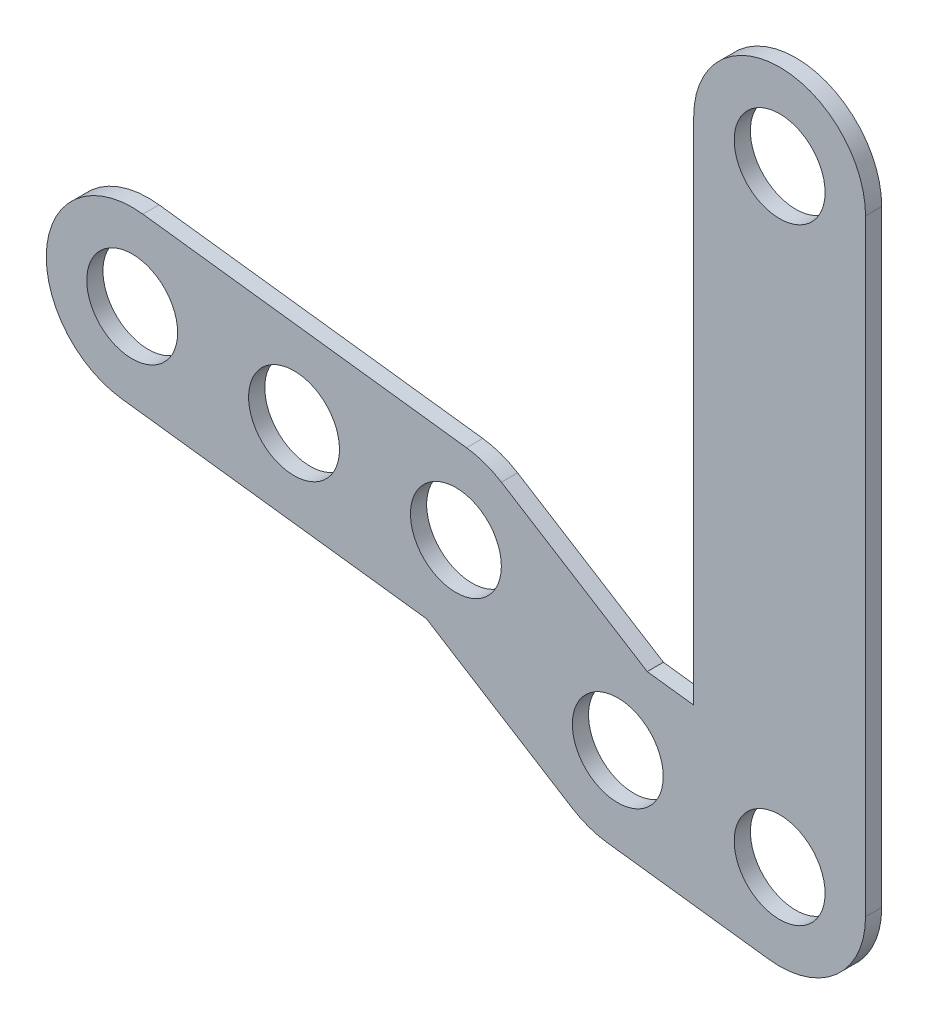
ISO-10303-21;
HEADER;
FILE_DESCRIPTION(('STEP AP214'),'2;1');
FILE_NAME('part.step','',(''),(''),'','','');
FILE_SCHEMA(('AUTOMOTIVE_DESIGN { 1 0 10303 214 1 1 1 1 }'));
ENDSEC;
DATA;
#1=APPLICATION_CONTEXT('core data for automotive mechanical design processes');
#2=APPLICATION_PROTOCOL_DEFINITION('international standard','automotive_design',2000,#1);
#3=PRODUCT_CONTEXT('',#1,'mechanical');
#4=PRODUCT('Part','Part','',(#3));
#5=PRODUCT_RELATED_PRODUCT_CATEGORY('part','',(#4));
#6=PRODUCT_DEFINITION_FORMATION('','',#4);
#7=PRODUCT_DEFINITION_CONTEXT('part definition',#1,'design');
#8=PRODUCT_DEFINITION('design','',#6,#7);
#9=PRODUCT_DEFINITION_SHAPE('','',#8);
#10=(LENGTH_UNIT() NAMED_UNIT(*) SI_UNIT(.MILLI.,.METRE.));
#11=(NAMED_UNIT(*) PLANE_ANGLE_UNIT() SI_UNIT($,.RADIAN.));
#12=(NAMED_UNIT(*) SI_UNIT($,.STERADIAN.) SOLID_ANGLE_UNIT());
#13=UNCERTAINTY_MEASURE_WITH_UNIT(LENGTH_MEASURE(1.E-05),#10,'distance_accuracy_value','');
#14=(GEOMETRIC_REPRESENTATION_CONTEXT(3) GLOBAL_UNCERTAINTY_ASSIGNED_CONTEXT((#13)) GLOBAL_UNIT_ASSIGNED_CONTEXT((#10,
#11,#12)) REPRESENTATION_CONTEXT('',''));
#15=CARTESIAN_POINT('',(0.,0.,0.));
#16=DIRECTION('',(0.,0.,1.));
#17=DIRECTION('',(1.,0.,0.));
#18=AXIS2_PLACEMENT_3D('',#15,#16,#17);
#19=CARTESIAN_POINT('',(266.699999999886,31.749999999901,5.08));
#20=DIRECTION('',(0.,0.,1.));
#21=DIRECTION('',(1.,0.,0.));
#22=AXIS2_PLACEMENT_3D('',#19,#20,#21);
#23=PLANE('',#22);
#24=CARTESIAN_POINT('',(266.699999999692,222.24999999973,5.08));
#25=DIRECTION('',(0.,0.,1.));
#26=DIRECTION('',(1.,0.,0.));
#27=AXIS2_PLACEMENT_3D('',#24,#25,#26);
#28=CIRCLE('',#27,14.2621000003079);
#29=CARTESIAN_POINT('',(280.9621,222.24999999973,5.08));
#30=VERTEX_POINT('',#29);
#31=EDGE_CURVE('E322',#30,#30,#28,.T.);
#32=ORIENTED_EDGE('',*,*,#31,.F.);
#33=EDGE_LOOP('',(#32));
#34=FACE_BOUND('',#33,.T.);
#35=CARTESIAN_POINT('',(165.09999999997,69.8499999997621,5.08));
#36=DIRECTION('',(0.,0.,1.));
#37=DIRECTION('',(1.,0.,0.));
#38=AXIS2_PLACEMENT_3D('',#35,#36,#37);
#39=CIRCLE('',#38,14.2621000000297);
#40=CARTESIAN_POINT('',(179.3621,69.8499999997621,5.08));
#41=VERTEX_POINT('',#40);
#42=EDGE_CURVE('E334',#41,#41,#39,.T.);
#43=ORIENTED_EDGE('',*,*,#42,.F.);
#44=EDGE_LOOP('',(#43));
#45=FACE_BOUND('',#44,.T.);
#46=CARTESIAN_POINT('',(63.5,82.55,5.08));
#47=DIRECTION('',(0.,0.,1.));
#48=DIRECTION('',(1.,0.,0.));
#49=AXIS2_PLACEMENT_3D('',#46,#47,#48);
#50=CIRCLE('',#49,14.2621);
#51=CARTESIAN_POINT('',(77.7621,82.55,5.08));
#52=VERTEX_POINT('',#51);
#53=EDGE_CURVE('E174',#52,#52,#50,.T.);
#54=ORIENTED_EDGE('',*,*,#53,.F.);
#55=EDGE_LOOP('',(#54));
#56=FACE_BOUND('',#55,.T.);
#57=CARTESIAN_POINT('',(266.699999999886,31.749999999901,5.08));
#58=DIRECTION('',(0.,0.,1.));
#59=DIRECTION('',(1.,0.,0.));
#60=AXIS2_PLACEMENT_3D('',#57,#58,#59);
#61=CIRCLE('',#60,26.9620999996552);
#62=CARTESIAN_POINT('',(263.355763081523,4.99610466061885,5.08));
#63=VERTEX_POINT('',#62);
#64=CARTESIAN_POINT('',(293.662099999541,31.749999999901,5.08));
#65=VERTEX_POINT('',#64);
#66=EDGE_CURVE('E195',#63,#65,#61,.T.);
#67=ORIENTED_EDGE('',*,*,#66,.T.);
#68=DIRECTION('',(0.,1.,0.));
#69=VECTOR('',#68,1.);
#70=CARTESIAN_POINT('',(293.662099999541,222.249999999901,5.08));
#71=LINE('',#70,#69);
#72=CARTESIAN_POINT('',(293.662099999541,222.249999999901,5.08));
#73=VERTEX_POINT('',#72);
#74=EDGE_CURVE('E118',#65,#73,#71,.T.);
#75=ORIENTED_EDGE('',*,*,#74,.T.);
#76=CARTESIAN_POINT('',(266.699999999692,222.24999999973,5.08));
#77=DIRECTION('',(0.,0.,1.));
#78=DIRECTION('',(1.,0.,0.));
#79=AXIS2_PLACEMENT_3D('',#76,#77,#78);
#80=CIRCLE('',#79,26.962099999849);
#81=CARTESIAN_POINT('',(239.737899999843,222.249999999559,5.08));
#82=VERTEX_POINT('',#81);
#83=EDGE_CURVE('E225',#73,#82,#80,.T.);
#84=ORIENTED_EDGE('',*,*,#83,.T.);
#85=DIRECTION('',(0.,-1.,0.));
#86=VECTOR('',#85,1.);
#87=CARTESIAN_POINT('',(239.737899999843,222.249999999559,5.08));
#88=LINE('',#87,#86);
#89=CARTESIAN_POINT('',(239.737899999843,62.2921874545589,5.08));
#90=VERTEX_POINT('',#89);
#91=EDGE_CURVE('E244',#82,#90,#88,.T.);
#92=ORIENTED_EDGE('',*,*,#91,.T.);
#93=DIRECTION('',(-0.992277876708353,0.124034734631725,0.));
#94=VECTOR('',#93,1.);
#95=CARTESIAN_POINT('',(225.146135762043,64.1161579849188,5.08));
#96=LINE('',#95,#94);
#97=CARTESIAN_POINT('',(225.146135762043,64.1161579849188,5.08));
#98=VERTEX_POINT('',#97);
#99=EDGE_CURVE('E241',#90,#98,#96,.T.);
#100=ORIENTED_EDGE('',*,*,#99,.T.);
#101=DIRECTION('',(-0.847998304020956,0.529998939977792,0.));
#102=VECTOR('',#101,1.);
#103=CARTESIAN_POINT('',(179.389884419763,92.7138150719389,5.08));
#104=LINE('',#103,#102);
#105=CARTESIAN_POINT('',(179.389884419763,92.7138150719389,5.08));
#106=VERTEX_POINT('',#105);
#107=EDGE_CURVE('E243',#98,#106,#104,.T.);
#108=ORIENTED_EDGE('',*,*,#107,.T.);
#109=CARTESIAN_POINT('',(165.09999999997,69.8499999997621,5.08));
#110=DIRECTION('',(0.,0.,1.));
#111=DIRECTION('',(1.,0.,0.));
#112=AXIS2_PLACEMENT_3D('',#109,#110,#111);
#113=CIRCLE('',#112,26.96209999955);
#114=CARTESIAN_POINT('',(168.44423691832,96.60389533894,5.08));
#115=VERTEX_POINT('',#114);
#116=EDGE_CURVE('E246',#106,#115,#113,.T.);
#117=ORIENTED_EDGE('',*,*,#116,.T.);
#118=DIRECTION('',(-0.992277876713668,0.124034734589209,0.));
#119=VECTOR('',#118,1.);
#120=CARTESIAN_POINT('',(66.84423691832,109.30389533894,5.08));
#121=LINE('',#120,#119);
#122=CARTESIAN_POINT('',(66.84423691832,109.30389533894,5.08));
#123=VERTEX_POINT('',#122);
#124=EDGE_CURVE('E252',#115,#123,#121,.T.);
#125=ORIENTED_EDGE('',*,*,#124,.T.);
#126=CARTESIAN_POINT('',(63.5,82.55,5.08));
#127=DIRECTION('',(0.,0.,1.));
#128=DIRECTION('',(1.,0.,0.));
#129=AXIS2_PLACEMENT_3D('',#126,#127,#128);
#130=CIRCLE('',#129,26.9620999993103);
#131=CARTESIAN_POINT('',(60.15576308168,55.79610466106,5.08));
#132=VERTEX_POINT('',#131);
#133=EDGE_CURVE('E254',#123,#132,#130,.T.);
#134=ORIENTED_EDGE('',*,*,#133,.T.);
#135=DIRECTION('',(0.992277876711237,-0.124034734608657,0.));
#136=VECTOR('',#135,1.);
#137=CARTESIAN_POINT('',(60.15576308168,55.79610466106,5.08));
#138=LINE('',#137,#136);
#139=CARTESIAN_POINT('',(155.8538642378,43.83384201464,5.08));
#140=VERTEX_POINT('',#139);
#141=EDGE_CURVE('E152',#132,#140,#138,.T.);
#142=ORIENTED_EDGE('',*,*,#141,.T.);
#143=DIRECTION('',(0.847998304020955,-0.529998939977792,0.));
#144=VECTOR('',#143,1.);
#145=CARTESIAN_POINT('',(155.8538642378,43.83384201464,5.08));
#146=LINE('',#145,#144);
#147=CARTESIAN_POINT('',(201.61011558008,15.23618492762,5.08));
#148=VERTEX_POINT('',#147);
#149=EDGE_CURVE('E146',#140,#148,#146,.T.);
#150=ORIENTED_EDGE('',*,*,#149,.T.);
#151=CARTESIAN_POINT('',(215.899999999873,38.0999999997967,5.08));
#152=DIRECTION('',(0.,0.,1.));
#153=DIRECTION('',(1.,0.,0.));
#154=AXIS2_PLACEMENT_3D('',#151,#152,#153);
#155=CIRCLE('',#154,26.96209999955);
#156=CARTESIAN_POINT('',(212.555763081523,11.3461046606189,5.08));
#157=VERTEX_POINT('',#156);
#158=EDGE_CURVE('E150',#148,#157,#155,.T.);
#159=ORIENTED_EDGE('',*,*,#158,.T.);
#160=DIRECTION('',(0.992277876713668,-0.124034734589208,0.));
#161=VECTOR('',#160,1.);
#162=CARTESIAN_POINT('',(212.555763081523,11.3461046606189,5.08));
#163=LINE('',#162,#161);
#164=EDGE_CURVE('E60',#157,#63,#163,.T.);
#165=ORIENTED_EDGE('',*,*,#164,.T.);
#166=EDGE_LOOP('',(#67,#75,#84,#92,#100,#108,#117,#125,#134,#142,#150,#159,#165));
#167=FACE_BOUND('',#166,.T.);
#168=CARTESIAN_POINT('',(114.3,76.2,5.08));
#169=DIRECTION('',(0.,0.,1.));
#170=DIRECTION('',(1.,0.,0.));
#171=AXIS2_PLACEMENT_3D('',#168,#169,#170);
#172=CIRCLE('',#171,14.2621);
#173=CARTESIAN_POINT('',(128.5621,76.2,5.08));
#174=VERTEX_POINT('',#173);
#175=EDGE_CURVE('E340',#174,#174,#172,.T.);
#176=ORIENTED_EDGE('',*,*,#175,.F.);
#177=EDGE_LOOP('',(#176));
#178=FACE_BOUND('',#177,.T.);
#179=CARTESIAN_POINT('',(215.899999999873,38.0999999997967,5.08));
#180=DIRECTION('',(0.,0.,1.));
#181=DIRECTION('',(1.,0.,0.));
#182=AXIS2_PLACEMENT_3D('',#179,#180,#181);
#183=CIRCLE('',#182,14.262100000127);
#184=CARTESIAN_POINT('',(230.1621,38.0999999997967,5.08));
#185=VERTEX_POINT('',#184);
#186=EDGE_CURVE('E328',#185,#185,#183,.T.);
#187=ORIENTED_EDGE('',*,*,#186,.F.);
#188=EDGE_LOOP('',(#187));
#189=FACE_BOUND('',#188,.T.);
#190=CARTESIAN_POINT('',(266.699999999886,31.749999999901,5.08));
#191=DIRECTION('',(0.,0.,1.));
#192=DIRECTION('',(1.,0.,0.));
#193=AXIS2_PLACEMENT_3D('',#190,#191,#192);
#194=CIRCLE('',#193,14.2621000001141);
#195=CARTESIAN_POINT('',(280.9621,31.749999999901,5.08));
#196=VERTEX_POINT('',#195);
#197=EDGE_CURVE('E313',#196,#196,#194,.T.);
#198=ORIENTED_EDGE('',*,*,#197,.F.);
#199=EDGE_LOOP('',(#198));
#200=FACE_BOUND('',#199,.T.);
#201=ADVANCED_FACE('F43',(#34,#45,#56,#167,#178,#189,#200),#23,.T.);
#202=CARTESIAN_POINT('',(266.699999999886,31.749999999901,0.));
#203=DIRECTION('',(0.,0.,1.));
#204=DIRECTION('',(1.,0.,0.));
#205=AXIS2_PLACEMENT_3D('',#202,#203,#204);
#206=PLANE('',#205);
#207=CARTESIAN_POINT('',(266.699999999886,31.749999999901,0.));
#208=DIRECTION('',(0.,0.,1.));
#209=DIRECTION('',(1.,0.,0.));
#210=AXIS2_PLACEMENT_3D('',#207,#208,#209);
#211=CIRCLE('',#210,26.9620999996552);
#212=CARTESIAN_POINT('',(263.355763081523,4.99610466061885,0.));
#213=VERTEX_POINT('',#212);
#214=CARTESIAN_POINT('',(293.662099999541,31.749999999901,0.));
#215=VERTEX_POINT('',#214);
#216=EDGE_CURVE('E170',#213,#215,#211,.T.);
#217=ORIENTED_EDGE('',*,*,#216,.F.);
#218=DIRECTION('',(0.992277876713668,-0.124034734589208,0.));
#219=VECTOR('',#218,1.);
#220=CARTESIAN_POINT('',(212.555763081523,11.3461046606189,0.));
#221=LINE('',#220,#219);
#222=CARTESIAN_POINT('',(212.555763081523,11.3461046606189,0.));
#223=VERTEX_POINT('',#222);
#224=EDGE_CURVE('E110',#223,#213,#221,.T.);
#225=ORIENTED_EDGE('',*,*,#224,.F.);
#226=CARTESIAN_POINT('',(215.899999999873,38.0999999997967,0.));
#227=DIRECTION('',(0.,0.,1.));
#228=DIRECTION('',(1.,0.,0.));
#229=AXIS2_PLACEMENT_3D('',#226,#227,#228);
#230=CIRCLE('',#229,26.96209999955);
#231=CARTESIAN_POINT('',(201.61011558008,15.23618492762,0.));
#232=VERTEX_POINT('',#231);
#233=EDGE_CURVE('E104',#232,#223,#230,.T.);
#234=ORIENTED_EDGE('',*,*,#233,.F.);
#235=DIRECTION('',(0.847998304020955,-0.529998939977792,0.));
#236=VECTOR('',#235,1.);
#237=CARTESIAN_POINT('',(155.8538642378,43.83384201464,0.));
#238=LINE('',#237,#236);
#239=CARTESIAN_POINT('',(155.8538642378,43.83384201464,0.));
#240=VERTEX_POINT('',#239);
#241=EDGE_CURVE('E160',#240,#232,#238,.T.);
#242=ORIENTED_EDGE('',*,*,#241,.F.);
#243=DIRECTION('',(0.992277876711237,-0.124034734608657,0.));
#244=VECTOR('',#243,1.);
#245=CARTESIAN_POINT('',(60.15576308168,55.79610466106,0.));
#246=LINE('',#245,#244);
#247=CARTESIAN_POINT('',(60.15576308168,55.79610466106,0.));
#248=VERTEX_POINT('',#247);
#249=EDGE_CURVE('E190',#248,#240,#246,.T.);
#250=ORIENTED_EDGE('',*,*,#249,.F.);
#251=CARTESIAN_POINT('',(63.5,82.55,0.));
#252=DIRECTION('',(0.,0.,1.));
#253=DIRECTION('',(1.,0.,0.));
#254=AXIS2_PLACEMENT_3D('',#251,#252,#253);
#255=CIRCLE('',#254,26.9620999993103);
#256=CARTESIAN_POINT('',(66.84423691832,109.30389533894,0.));
#257=VERTEX_POINT('',#256);
#258=EDGE_CURVE('E188',#257,#248,#255,.T.);
#259=ORIENTED_EDGE('',*,*,#258,.F.);
#260=DIRECTION('',(-0.992277876713668,0.124034734589209,0.));
#261=VECTOR('',#260,1.);
#262=CARTESIAN_POINT('',(66.84423691832,109.30389533894,0.));
#263=LINE('',#262,#261);
#264=CARTESIAN_POINT('',(168.44423691832,96.60389533894,0.));
#265=VERTEX_POINT('',#264);
#266=EDGE_CURVE('E186',#265,#257,#263,.T.);
#267=ORIENTED_EDGE('',*,*,#266,.F.);
#268=CARTESIAN_POINT('',(165.09999999997,69.8499999997621,0.));
#269=DIRECTION('',(0.,0.,1.));
#270=DIRECTION('',(1.,0.,0.));
#271=AXIS2_PLACEMENT_3D('',#268,#269,#270);
#272=CIRCLE('',#271,26.96209999955);
#273=CARTESIAN_POINT('',(179.389884419763,92.7138150719389,0.));
#274=VERTEX_POINT('',#273);
#275=EDGE_CURVE('E184',#274,#265,#272,.T.);
#276=ORIENTED_EDGE('',*,*,#275,.F.);
#277=DIRECTION('',(-0.847998304020956,0.529998939977792,0.));
#278=VECTOR('',#277,1.);
#279=CARTESIAN_POINT('',(179.389884419763,92.7138150719389,0.));
#280=LINE('',#279,#278);
#281=CARTESIAN_POINT('',(225.146135762043,64.1161579849188,0.));
#282=VERTEX_POINT('',#281);
#283=EDGE_CURVE('E182',#282,#274,#280,.T.);
#284=ORIENTED_EDGE('',*,*,#283,.F.);
#285=DIRECTION('',(-0.992277876708353,0.124034734631725,0.));
#286=VECTOR('',#285,1.);
#287=CARTESIAN_POINT('',(225.146135762043,64.1161579849188,0.));
#288=LINE('',#287,#286);
#289=CARTESIAN_POINT('',(239.737899999843,62.2921874545589,0.));
#290=VERTEX_POINT('',#289);
#291=EDGE_CURVE('E180',#290,#282,#288,.T.);
#292=ORIENTED_EDGE('',*,*,#291,.F.);
#293=DIRECTION('',(0.,-1.,0.));
#294=VECTOR('',#293,1.);
#295=CARTESIAN_POINT('',(239.737899999843,222.249999999559,0.));
#296=LINE('',#295,#294);
#297=CARTESIAN_POINT('',(239.737899999843,222.249999999559,0.));
#298=VERTEX_POINT('',#297);
#299=EDGE_CURVE('E178',#298,#290,#296,.T.);
#300=ORIENTED_EDGE('',*,*,#299,.F.);
#301=CARTESIAN_POINT('',(266.699999999692,222.24999999973,0.));
#302=DIRECTION('',(0.,0.,1.));
#303=DIRECTION('',(1.,0.,0.));
#304=AXIS2_PLACEMENT_3D('',#301,#302,#303);
#305=CIRCLE('',#304,26.962099999849);
#306=CARTESIAN_POINT('',(293.662099999541,222.249999999901,0.));
#307=VERTEX_POINT('',#306);
#308=EDGE_CURVE('E176',#307,#298,#305,.T.);
#309=ORIENTED_EDGE('',*,*,#308,.F.);
#310=DIRECTION('',(0.,1.,0.));
#311=VECTOR('',#310,1.);
#312=CARTESIAN_POINT('',(293.662099999541,222.249999999901,0.));
#313=LINE('',#312,#311);
#314=EDGE_CURVE('E173',#215,#307,#313,.T.);
#315=ORIENTED_EDGE('',*,*,#314,.F.);
#316=EDGE_LOOP('',(#217,#225,#234,#242,#250,#259,#267,#276,#284,#292,#300,#309,#315));
#317=FACE_BOUND('',#316,.T.);
#318=CARTESIAN_POINT('',(63.5,82.55,0.));
#319=DIRECTION('',(0.,0.,1.));
#320=DIRECTION('',(1.,0.,0.));
#321=AXIS2_PLACEMENT_3D('',#318,#319,#320);
#322=CIRCLE('',#321,14.2621);
#323=CARTESIAN_POINT('',(77.7621,82.55,0.));
#324=VERTEX_POINT('',#323);
#325=EDGE_CURVE('E343',#324,#324,#322,.T.);
#326=ORIENTED_EDGE('',*,*,#325,.T.);
#327=EDGE_LOOP('',(#326));
#328=FACE_BOUND('',#327,.T.);
#329=CARTESIAN_POINT('',(114.3,76.2,0.));
#330=DIRECTION('',(0.,0.,1.));
#331=DIRECTION('',(1.,0.,0.));
#332=AXIS2_PLACEMENT_3D('',#329,#330,#331);
#333=CIRCLE('',#332,14.2621);
#334=CARTESIAN_POINT('',(128.5621,76.2,0.));
#335=VERTEX_POINT('',#334);
#336=EDGE_CURVE('E337',#335,#335,#333,.T.);
#337=ORIENTED_EDGE('',*,*,#336,.T.);
#338=EDGE_LOOP('',(#337));
#339=FACE_BOUND('',#338,.T.);
#340=CARTESIAN_POINT('',(165.09999999997,69.8499999997621,0.));
#341=DIRECTION('',(0.,0.,1.));
#342=DIRECTION('',(1.,0.,0.));
#343=AXIS2_PLACEMENT_3D('',#340,#341,#342);
#344=CIRCLE('',#343,14.2621000000297);
#345=CARTESIAN_POINT('',(179.3621,69.8499999997621,0.));
#346=VERTEX_POINT('',#345);
#347=EDGE_CURVE('E331',#346,#346,#344,.T.);
#348=ORIENTED_EDGE('',*,*,#347,.T.);
#349=EDGE_LOOP('',(#348));
#350=FACE_BOUND('',#349,.T.);
#351=CARTESIAN_POINT('',(215.899999999873,38.0999999997967,0.));
#352=DIRECTION('',(0.,0.,1.));
#353=DIRECTION('',(1.,0.,0.));
#354=AXIS2_PLACEMENT_3D('',#351,#352,#353);
#355=CIRCLE('',#354,14.262100000127);
#356=CARTESIAN_POINT('',(230.1621,38.0999999997967,0.));
#357=VERTEX_POINT('',#356);
#358=EDGE_CURVE('E325',#357,#357,#355,.T.);
#359=ORIENTED_EDGE('',*,*,#358,.T.);
#360=EDGE_LOOP('',(#359));
#361=FACE_BOUND('',#360,.T.);
#362=CARTESIAN_POINT('',(266.699999999692,222.24999999973,0.));
#363=DIRECTION('',(0.,0.,1.));
#364=DIRECTION('',(1.,0.,0.));
#365=AXIS2_PLACEMENT_3D('',#362,#363,#364);
#366=CIRCLE('',#365,14.2621000003079);
#367=CARTESIAN_POINT('',(280.9621,222.24999999973,0.));
#368=VERTEX_POINT('',#367);
#369=EDGE_CURVE('E319',#368,#368,#366,.T.);
#370=ORIENTED_EDGE('',*,*,#369,.T.);
#371=EDGE_LOOP('',(#370));
#372=FACE_BOUND('',#371,.T.);
#373=CARTESIAN_POINT('',(266.699999999886,31.749999999901,0.));
#374=DIRECTION('',(0.,0.,1.));
#375=DIRECTION('',(1.,0.,0.));
#376=AXIS2_PLACEMENT_3D('',#373,#374,#375);
#377=CIRCLE('',#376,14.2621000001141);
#378=CARTESIAN_POINT('',(280.9621,31.749999999901,0.));
#379=VERTEX_POINT('',#378);
#380=EDGE_CURVE('E316',#379,#379,#377,.T.);
#381=ORIENTED_EDGE('',*,*,#380,.T.);
#382=EDGE_LOOP('',(#381));
#383=FACE_BOUND('',#382,.T.);
#384=ADVANCED_FACE('F229',(#317,#328,#339,#350,#361,#372,#383),#206,.F.);
#385=CARTESIAN_POINT('',(266.699999999886,31.749999999901,5.08));
#386=DIRECTION('',(0.,0.,-1.));
#387=DIRECTION('',(-1.,0.,0.));
#388=AXIS2_PLACEMENT_3D('',#385,#386,#387);
#389=CYLINDRICAL_SURFACE('',#388,26.9620999996552);
#390=ORIENTED_EDGE('',*,*,#216,.T.);
#391=DIRECTION('',(0.,0.,-1.));
#392=VECTOR('',#391,1.);
#393=CARTESIAN_POINT('',(293.662099999541,31.749999999901,5.08));
#394=LINE('',#393,#392);
#395=EDGE_CURVE('E11',#65,#215,#394,.T.);
#396=ORIENTED_EDGE('',*,*,#395,.F.);
#397=ORIENTED_EDGE('',*,*,#66,.F.);
#398=DIRECTION('',(0.,0.,-1.));
#399=VECTOR('',#398,1.);
#400=CARTESIAN_POINT('',(263.355763081523,4.99610466061885,5.08));
#401=LINE('',#400,#399);
#402=EDGE_CURVE('E166',#63,#213,#401,.T.);
#403=ORIENTED_EDGE('',*,*,#402,.T.);
#404=EDGE_LOOP('',(#390,#396,#397,#403));
#405=FACE_BOUND('',#404,.T.);
#406=ADVANCED_FACE('F45',(#405),#389,.T.);
#407=CARTESIAN_POINT('',(293.662099999541,222.249999999901,5.08));
#408=DIRECTION('',(-1.,0.,0.));
#409=DIRECTION('',(0.,0.,1.));
#410=AXIS2_PLACEMENT_3D('',#407,#408,#409);
#411=PLANE('',#410);
#412=ORIENTED_EDGE('',*,*,#314,.T.);
#413=DIRECTION('',(0.,0.,-1.));
#414=VECTOR('',#413,1.);
#415=CARTESIAN_POINT('',(293.662099999541,222.249999999901,5.08));
#416=LINE('',#415,#414);
#417=EDGE_CURVE('E52',#73,#307,#416,.T.);
#418=ORIENTED_EDGE('',*,*,#417,.F.);
#419=ORIENTED_EDGE('',*,*,#74,.F.);
#420=ORIENTED_EDGE('',*,*,#395,.T.);
#421=EDGE_LOOP('',(#412,#418,#419,#420));
#422=FACE_BOUND('',#421,.T.);
#423=ADVANCED_FACE('F487',(#422),#411,.F.);
#424=CARTESIAN_POINT('',(266.699999999692,222.24999999973,5.08));
#425=DIRECTION('',(0.,0.,-1.));
#426=DIRECTION('',(-1.,0.,0.));
#427=AXIS2_PLACEMENT_3D('',#424,#425,#426);
#428=CYLINDRICAL_SURFACE('',#427,26.962099999849);
#429=ORIENTED_EDGE('',*,*,#308,.T.);
#430=DIRECTION('',(0.,0.,-1.));
#431=VECTOR('',#430,1.);
#432=CARTESIAN_POINT('',(239.737899999843,222.249999999559,5.08));
#433=LINE('',#432,#431);
#434=EDGE_CURVE('E217',#82,#298,#433,.T.);
#435=ORIENTED_EDGE('',*,*,#434,.F.);
#436=ORIENTED_EDGE('',*,*,#83,.F.);
#437=ORIENTED_EDGE('',*,*,#417,.T.);
#438=EDGE_LOOP('',(#429,#435,#436,#437));
#439=FACE_BOUND('',#438,.T.);
#440=ADVANCED_FACE('F223',(#439),#428,.T.);
#441=CARTESIAN_POINT('',(239.737899999843,222.249999999559,5.08));
#442=DIRECTION('',(1.,0.,0.));
#443=DIRECTION('',(0.,0.,-1.));
#444=AXIS2_PLACEMENT_3D('',#441,#442,#443);
#445=PLANE('',#444);
#446=ORIENTED_EDGE('',*,*,#299,.T.);
#447=DIRECTION('',(0.,0.,-1.));
#448=VECTOR('',#447,1.);
#449=CARTESIAN_POINT('',(239.737899999843,62.2921874545589,5.08));
#450=LINE('',#449,#448);
#451=EDGE_CURVE('E214',#90,#290,#450,.T.);
#452=ORIENTED_EDGE('',*,*,#451,.F.);
#453=ORIENTED_EDGE('',*,*,#91,.F.);
#454=ORIENTED_EDGE('',*,*,#434,.T.);
#455=EDGE_LOOP('',(#446,#452,#453,#454));
#456=FACE_BOUND('',#455,.T.);
#457=ADVANCED_FACE('F235',(#456),#445,.F.);
#458=CARTESIAN_POINT('',(225.146135762043,64.1161579849188,5.08));
#459=DIRECTION('',(-0.124034734631725,-0.992277876708353,0.));
#460=DIRECTION('',(0.992277876708353,-0.124034734631725,0.));
#461=AXIS2_PLACEMENT_3D('',#458,#459,#460);
#462=PLANE('',#461);
#463=ORIENTED_EDGE('',*,*,#291,.T.);
#464=DIRECTION('',(0.,0.,-1.));
#465=VECTOR('',#464,1.);
#466=CARTESIAN_POINT('',(225.146135762043,64.1161579849188,5.08));
#467=LINE('',#466,#465);
#468=EDGE_CURVE('E211',#98,#282,#467,.T.);
#469=ORIENTED_EDGE('',*,*,#468,.F.);
#470=ORIENTED_EDGE('',*,*,#99,.F.);
#471=ORIENTED_EDGE('',*,*,#451,.T.);
#472=EDGE_LOOP('',(#463,#469,#470,#471));
#473=FACE_BOUND('',#472,.T.);
#474=ADVANCED_FACE('F239',(#473),#462,.F.);
#475=CARTESIAN_POINT('',(179.389884419763,92.7138150719389,5.08));
#476=DIRECTION('',(-0.529998939977792,-0.847998304020956,0.));
#477=DIRECTION('',(0.847998304020956,-0.529998939977792,0.));
#478=AXIS2_PLACEMENT_3D('',#475,#476,#477);
#479=PLANE('',#478);
#480=ORIENTED_EDGE('',*,*,#283,.T.);
#481=DIRECTION('',(0.,0.,-1.));
#482=VECTOR('',#481,1.);
#483=CARTESIAN_POINT('',(179.389884419763,92.7138150719389,5.08));
#484=LINE('',#483,#482);
#485=EDGE_CURVE('E208',#106,#274,#484,.T.);
#486=ORIENTED_EDGE('',*,*,#485,.F.);
#487=ORIENTED_EDGE('',*,*,#107,.F.);
#488=ORIENTED_EDGE('',*,*,#468,.T.);
#489=EDGE_LOOP('',(#480,#486,#487,#488));
#490=FACE_BOUND('',#489,.T.);
#491=ADVANCED_FACE('F452',(#490),#479,.F.);
#492=CARTESIAN_POINT('',(165.09999999997,69.8499999997621,5.08));
#493=DIRECTION('',(0.,0.,-1.));
#494=DIRECTION('',(-1.,0.,0.));
#495=AXIS2_PLACEMENT_3D('',#492,#493,#494);
#496=CYLINDRICAL_SURFACE('',#495,26.96209999955);
#497=ORIENTED_EDGE('',*,*,#275,.T.);
#498=DIRECTION('',(0.,0.,-1.));
#499=VECTOR('',#498,1.);
#500=CARTESIAN_POINT('',(168.44423691832,96.60389533894,5.08));
#501=LINE('',#500,#499);
#502=EDGE_CURVE('E205',#115,#265,#501,.T.);
#503=ORIENTED_EDGE('',*,*,#502,.F.);
#504=ORIENTED_EDGE('',*,*,#116,.F.);
#505=ORIENTED_EDGE('',*,*,#485,.T.);
#506=EDGE_LOOP('',(#497,#503,#504,#505));
#507=FACE_BOUND('',#506,.T.);
#508=ADVANCED_FACE('F442',(#507),#496,.T.);
#509=CARTESIAN_POINT('',(66.84423691832,109.30389533894,5.08));
#510=DIRECTION('',(-0.124034734589209,-0.992277876713668,0.));
#511=DIRECTION('',(0.992277876713668,-0.124034734589209,0.));
#512=AXIS2_PLACEMENT_3D('',#509,#510,#511);
#513=PLANE('',#512);
#514=ORIENTED_EDGE('',*,*,#266,.T.);
#515=DIRECTION('',(0.,0.,-1.));
#516=VECTOR('',#515,1.);
#517=CARTESIAN_POINT('',(66.84423691832,109.30389533894,5.08));
#518=LINE('',#517,#516);
#519=EDGE_CURVE('E202',#123,#257,#518,.T.);
#520=ORIENTED_EDGE('',*,*,#519,.F.);
#521=ORIENTED_EDGE('',*,*,#124,.F.);
#522=ORIENTED_EDGE('',*,*,#502,.T.);
#523=EDGE_LOOP('',(#514,#520,#521,#522));
#524=FACE_BOUND('',#523,.T.);
#525=ADVANCED_FACE('F433',(#524),#513,.F.);
#526=CARTESIAN_POINT('',(63.5,82.55,5.08));
#527=DIRECTION('',(0.,0.,-1.));
#528=DIRECTION('',(-1.,0.,0.));
#529=AXIS2_PLACEMENT_3D('',#526,#527,#528);
#530=CYLINDRICAL_SURFACE('',#529,26.9620999993103);
#531=ORIENTED_EDGE('',*,*,#258,.T.);
#532=DIRECTION('',(0.,0.,-1.));
#533=VECTOR('',#532,1.);
#534=CARTESIAN_POINT('',(60.15576308168,55.79610466106,5.08));
#535=LINE('',#534,#533);
#536=EDGE_CURVE('E199',#132,#248,#535,.T.);
#537=ORIENTED_EDGE('',*,*,#536,.F.);
#538=ORIENTED_EDGE('',*,*,#133,.F.);
#539=ORIENTED_EDGE('',*,*,#519,.T.);
#540=EDGE_LOOP('',(#531,#537,#538,#539));
#541=FACE_BOUND('',#540,.T.);
#542=ADVANCED_FACE('F260',(#541),#530,.T.);
#543=CARTESIAN_POINT('',(60.15576308168,55.79610466106,5.08));
#544=DIRECTION('',(0.124034734608657,0.992277876711236,0.));
#545=DIRECTION('',(-0.992277876711237,0.124034734608657,0.));
#546=AXIS2_PLACEMENT_3D('',#543,#544,#545);
#547=PLANE('',#546);
#548=ORIENTED_EDGE('',*,*,#249,.T.);
#549=DIRECTION('',(0.,0.,-1.));
#550=VECTOR('',#549,1.);
#551=CARTESIAN_POINT('',(155.8538642378,43.83384201464,5.08));
#552=LINE('',#551,#550);
#553=EDGE_CURVE('E161',#140,#240,#552,.T.);
#554=ORIENTED_EDGE('',*,*,#553,.F.);
#555=ORIENTED_EDGE('',*,*,#141,.F.);
#556=ORIENTED_EDGE('',*,*,#536,.T.);
#557=EDGE_LOOP('',(#548,#554,#555,#556));
#558=FACE_BOUND('',#557,.T.);
#559=ADVANCED_FACE('F264',(#558),#547,.F.);
#560=CARTESIAN_POINT('',(155.8538642378,43.83384201464,5.08));
#561=DIRECTION('',(0.529998939977792,0.847998304020955,0.));
#562=DIRECTION('',(-0.847998304020955,0.529998939977792,0.));
#563=AXIS2_PLACEMENT_3D('',#560,#561,#562);
#564=PLANE('',#563);
#565=ORIENTED_EDGE('',*,*,#241,.T.);
#566=DIRECTION('',(0.,0.,-1.));
#567=VECTOR('',#566,1.);
#568=CARTESIAN_POINT('',(201.61011558008,15.23618492762,5.08));
#569=LINE('',#568,#567);
#570=EDGE_CURVE('E157',#148,#232,#569,.T.);
#571=ORIENTED_EDGE('',*,*,#570,.F.);
#572=ORIENTED_EDGE('',*,*,#149,.F.);
#573=ORIENTED_EDGE('',*,*,#553,.T.);
#574=EDGE_LOOP('',(#565,#571,#572,#573));
#575=FACE_BOUND('',#574,.T.);
#576=ADVANCED_FACE('F158',(#575),#564,.F.);
#577=CARTESIAN_POINT('',(215.899999999873,38.0999999997967,5.08));
#578=DIRECTION('',(0.,0.,-1.));
#579=DIRECTION('',(-1.,0.,0.));
#580=AXIS2_PLACEMENT_3D('',#577,#578,#579);
#581=CYLINDRICAL_SURFACE('',#580,26.96209999955);
#582=ORIENTED_EDGE('',*,*,#233,.T.);
#583=DIRECTION('',(0.,0.,-1.));
#584=VECTOR('',#583,1.);
#585=CARTESIAN_POINT('',(212.555763081523,11.3461046606189,5.08));
#586=LINE('',#585,#584);
#587=EDGE_CURVE('E162',#157,#223,#586,.T.);
#588=ORIENTED_EDGE('',*,*,#587,.F.);
#589=ORIENTED_EDGE('',*,*,#158,.F.);
#590=ORIENTED_EDGE('',*,*,#570,.T.);
#591=EDGE_LOOP('',(#582,#588,#589,#590));
#592=FACE_BOUND('',#591,.T.);
#593=ADVANCED_FACE('F164',(#592),#581,.T.);
#594=CARTESIAN_POINT('',(212.555763081523,11.3461046606189,5.08));
#595=DIRECTION('',(0.124034734589208,0.992277876713668,0.));
#596=DIRECTION('',(-0.992277876713668,0.124034734589208,0.));
#597=AXIS2_PLACEMENT_3D('',#594,#595,#596);
#598=PLANE('',#597);
#599=ORIENTED_EDGE('',*,*,#224,.T.);
#600=ORIENTED_EDGE('',*,*,#402,.F.);
#601=ORIENTED_EDGE('',*,*,#164,.F.);
#602=ORIENTED_EDGE('',*,*,#587,.T.);
#603=EDGE_LOOP('',(#599,#600,#601,#602));
#604=FACE_BOUND('',#603,.T.);
#605=ADVANCED_FACE('F268',(#604),#598,.F.);
#606=CARTESIAN_POINT('',(63.5,82.55,5.08));
#607=DIRECTION('',(0.,0.,-1.));
#608=DIRECTION('',(-1.,0.,0.));
#609=AXIS2_PLACEMENT_3D('',#606,#607,#608);
#610=CYLINDRICAL_SURFACE('',#609,14.2621);
#611=ORIENTED_EDGE('',*,*,#53,.T.);
#612=EDGE_LOOP('',(#611));
#613=FACE_BOUND('',#612,.T.);
#614=ORIENTED_EDGE('',*,*,#325,.F.);
#615=EDGE_LOOP('',(#614));
#616=FACE_BOUND('',#615,.T.);
#617=ADVANCED_FACE('F270',(#613,#616),#610,.F.);
#618=CARTESIAN_POINT('',(114.3,76.2,5.08));
#619=DIRECTION('',(0.,0.,-1.));
#620=DIRECTION('',(-1.,0.,0.));
#621=AXIS2_PLACEMENT_3D('',#618,#619,#620);
#622=CYLINDRICAL_SURFACE('',#621,14.2621);
#623=ORIENTED_EDGE('',*,*,#175,.T.);
#624=EDGE_LOOP('',(#623));
#625=FACE_BOUND('',#624,.T.);
#626=ORIENTED_EDGE('',*,*,#336,.F.);
#627=EDGE_LOOP('',(#626));
#628=FACE_BOUND('',#627,.T.);
#629=ADVANCED_FACE('F276',(#625,#628),#622,.F.);
#630=CARTESIAN_POINT('',(165.09999999997,69.8499999997621,5.08));
#631=DIRECTION('',(0.,0.,-1.));
#632=DIRECTION('',(-1.,0.,0.));
#633=AXIS2_PLACEMENT_3D('',#630,#631,#632);
#634=CYLINDRICAL_SURFACE('',#633,14.2621000000297);
#635=ORIENTED_EDGE('',*,*,#42,.T.);
#636=EDGE_LOOP('',(#635));
#637=FACE_BOUND('',#636,.T.);
#638=ORIENTED_EDGE('',*,*,#347,.F.);
#639=EDGE_LOOP('',(#638));
#640=FACE_BOUND('',#639,.T.);
#641=ADVANCED_FACE('F292',(#637,#640),#634,.F.);
#642=CARTESIAN_POINT('',(215.899999999873,38.0999999997967,5.08));
#643=DIRECTION('',(0.,0.,-1.));
#644=DIRECTION('',(-1.,0.,0.));
#645=AXIS2_PLACEMENT_3D('',#642,#643,#644);
#646=CYLINDRICAL_SURFACE('',#645,14.262100000127);
#647=ORIENTED_EDGE('',*,*,#186,.T.);
#648=EDGE_LOOP('',(#647));
#649=FACE_BOUND('',#648,.T.);
#650=ORIENTED_EDGE('',*,*,#358,.F.);
#651=EDGE_LOOP('',(#650));
#652=FACE_BOUND('',#651,.T.);
#653=ADVANCED_FACE('F296',(#649,#652),#646,.F.);
#654=CARTESIAN_POINT('',(266.699999999692,222.24999999973,5.08));
#655=DIRECTION('',(0.,0.,-1.));
#656=DIRECTION('',(-1.,0.,0.));
#657=AXIS2_PLACEMENT_3D('',#654,#655,#656);
#658=CYLINDRICAL_SURFACE('',#657,14.2621000003079);
#659=ORIENTED_EDGE('',*,*,#31,.T.);
#660=EDGE_LOOP('',(#659));
#661=FACE_BOUND('',#660,.T.);
#662=ORIENTED_EDGE('',*,*,#369,.F.);
#663=EDGE_LOOP('',(#662));
#664=FACE_BOUND('',#663,.T.);
#665=ADVANCED_FACE('F300',(#661,#664),#658,.F.);
#666=CARTESIAN_POINT('',(266.699999999886,31.749999999901,5.08));
#667=DIRECTION('',(0.,0.,-1.));
#668=DIRECTION('',(-1.,0.,0.));
#669=AXIS2_PLACEMENT_3D('',#666,#667,#668);
#670=CYLINDRICAL_SURFACE('',#669,14.2621000001141);
#671=ORIENTED_EDGE('',*,*,#197,.T.);
#672=EDGE_LOOP('',(#671));
#673=FACE_BOUND('',#672,.T.);
#674=ORIENTED_EDGE('',*,*,#380,.F.);
#675=EDGE_LOOP('',(#674));
#676=FACE_BOUND('',#675,.T.);
#677=ADVANCED_FACE('F304',(#673,#676),#670,.F.);
#678=CLOSED_SHELL('',(#201,#384,#406,#423,#440,#457,#474,#491,#508,#525,#542,#559,#576,#593,
#605,#617,#629,#641,#653,#665,#677));
#679=MANIFOLD_SOLID_BREP('B2',#678);
#680=ADVANCED_BREP_SHAPE_REPRESENTATION('',(#18,#679),#14);
#681=SHAPE_DEFINITION_REPRESENTATION(#9,#680);
ENDSEC;
END-ISO-10303-21;
